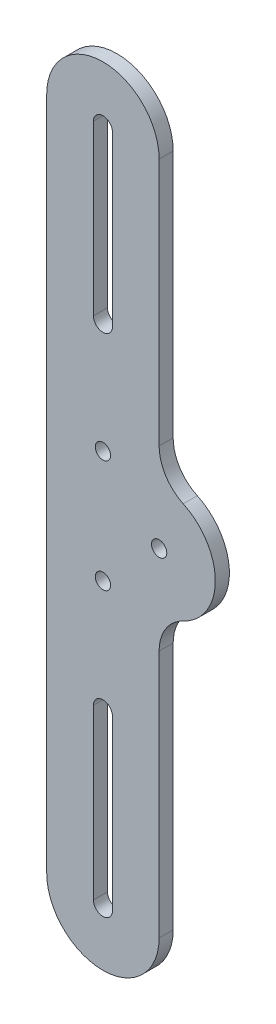
ISO-10303-21;
HEADER;
FILE_DESCRIPTION(('STEP AP214'),'2;1');
FILE_NAME('part.step','',(''),(''),'','','');
FILE_SCHEMA(('AUTOMOTIVE_DESIGN { 1 0 10303 214 1 1 1 1 }'));
ENDSEC;
DATA;
#1=APPLICATION_CONTEXT('core data for automotive mechanical design processes');
#2=APPLICATION_PROTOCOL_DEFINITION('international standard','automotive_design',2000,#1);
#3=PRODUCT_CONTEXT('',#1,'mechanical');
#4=PRODUCT('Part','Part','',(#3));
#5=PRODUCT_RELATED_PRODUCT_CATEGORY('part','',(#4));
#6=PRODUCT_DEFINITION_FORMATION('','',#4);
#7=PRODUCT_DEFINITION_CONTEXT('part definition',#1,'design');
#8=PRODUCT_DEFINITION('design','',#6,#7);
#9=PRODUCT_DEFINITION_SHAPE('','',#8);
#10=(LENGTH_UNIT() NAMED_UNIT(*) SI_UNIT(.MILLI.,.METRE.));
#11=(NAMED_UNIT(*) PLANE_ANGLE_UNIT() SI_UNIT($,.RADIAN.));
#12=(NAMED_UNIT(*) SI_UNIT($,.STERADIAN.) SOLID_ANGLE_UNIT());
#13=UNCERTAINTY_MEASURE_WITH_UNIT(LENGTH_MEASURE(1.E-05),#10,'distance_accuracy_value','');
#14=(GEOMETRIC_REPRESENTATION_CONTEXT(3) GLOBAL_UNCERTAINTY_ASSIGNED_CONTEXT((#13)) GLOBAL_UNIT_ASSIGNED_CONTEXT((#10,
#11,#12)) REPRESENTATION_CONTEXT('',''));
#15=CARTESIAN_POINT('',(0.,0.,0.));
#16=DIRECTION('',(0.,0.,1.));
#17=DIRECTION('',(1.,0.,0.));
#18=AXIS2_PLACEMENT_3D('',#15,#16,#17);
#19=CARTESIAN_POINT('',(-19.05,-88.9,1.5875));
#20=DIRECTION('',(1.,0.,0.));
#21=DIRECTION('',(0.,0.,-1.));
#22=AXIS2_PLACEMENT_3D('',#19,#20,#21);
#23=PLANE('',#22);
#24=DIRECTION('',(0.,0.,1.));
#25=VECTOR('',#24,1.);
#26=CARTESIAN_POINT('',(-19.05,76.2,-1.5875));
#27=LINE('',#26,#25);
#28=CARTESIAN_POINT('',(-19.05,76.2,-1.5875));
#29=VERTEX_POINT('',#28);
#30=CARTESIAN_POINT('',(-19.05,76.2,1.5875));
#31=VERTEX_POINT('',#30);
#32=EDGE_CURVE('E149',#29,#31,#27,.T.);
#33=ORIENTED_EDGE('',*,*,#32,.F.);
#34=DIRECTION('',(0.,-1.,0.));
#35=VECTOR('',#34,1.);
#36=CARTESIAN_POINT('',(-19.05,-88.9,-1.5875));
#37=LINE('',#36,#35);
#38=CARTESIAN_POINT('',(-19.05,-76.2,-1.5875));
#39=VERTEX_POINT('',#38);
#40=EDGE_CURVE('E159',#29,#39,#37,.T.);
#41=ORIENTED_EDGE('',*,*,#40,.T.);
#42=DIRECTION('',(0.,0.,1.));
#43=VECTOR('',#42,1.);
#44=CARTESIAN_POINT('',(-19.05,-76.2,-1.5875));
#45=LINE('',#44,#43);
#46=CARTESIAN_POINT('',(-19.05,-76.2,1.5875));
#47=VERTEX_POINT('',#46);
#48=EDGE_CURVE('E162',#39,#47,#45,.T.);
#49=ORIENTED_EDGE('',*,*,#48,.T.);
#50=DIRECTION('',(0.,-1.,0.));
#51=VECTOR('',#50,1.);
#52=CARTESIAN_POINT('',(-19.05,-88.9,1.5875));
#53=LINE('',#52,#51);
#54=EDGE_CURVE('E161',#31,#47,#53,.T.);
#55=ORIENTED_EDGE('',*,*,#54,.F.);
#56=EDGE_LOOP('',(#33,#41,#49,#55));
#57=FACE_BOUND('',#56,.T.);
#58=ADVANCED_FACE('F35',(#57),#23,.F.);
#59=CARTESIAN_POINT('',(0.,0.,1.5875));
#60=DIRECTION('',(0.,0.,1.));
#61=DIRECTION('',(1.,0.,0.));
#62=AXIS2_PLACEMENT_3D('',#59,#60,#61);
#63=PLANE('',#62);
#64=CARTESIAN_POINT('',(-6.35000000000001,-38.1,1.5875));
#65=DIRECTION('',(0.,0.,1.));
#66=DIRECTION('',(1.,0.,0.));
#67=AXIS2_PLACEMENT_3D('',#64,#65,#66);
#68=CIRCLE('',#67,2.14884);
#69=CARTESIAN_POINT('',(-4.20116000000001,-38.1,1.5875));
#70=VERTEX_POINT('',#69);
#71=CARTESIAN_POINT('',(-8.49884000000001,-38.1,1.5875));
#72=VERTEX_POINT('',#71);
#73=EDGE_CURVE('E49',#70,#72,#68,.T.);
#74=ORIENTED_EDGE('',*,*,#73,.F.);
#75=DIRECTION('',(0.,1.,0.));
#76=VECTOR('',#75,1.);
#77=CARTESIAN_POINT('',(-4.20116000000001,-38.1,1.5875));
#78=LINE('',#77,#76);
#79=CARTESIAN_POINT('',(-4.20116000000001,-76.2,1.5875));
#80=VERTEX_POINT('',#79);
#81=EDGE_CURVE('E232',#80,#70,#78,.T.);
#82=ORIENTED_EDGE('',*,*,#81,.F.);
#83=CARTESIAN_POINT('',(-6.35000000000001,-76.2,1.5875));
#84=DIRECTION('',(0.,0.,1.));
#85=DIRECTION('',(1.,0.,0.));
#86=AXIS2_PLACEMENT_3D('',#83,#84,#85);
#87=CIRCLE('',#86,2.14884);
#88=CARTESIAN_POINT('',(-8.49884000000001,-76.2,1.5875));
#89=VERTEX_POINT('',#88);
#90=EDGE_CURVE('E244',#89,#80,#87,.T.);
#91=ORIENTED_EDGE('',*,*,#90,.F.);
#92=DIRECTION('',(0.,-1.,0.));
#93=VECTOR('',#92,1.);
#94=CARTESIAN_POINT('',(-8.49884000000001,-38.1,1.5875));
#95=LINE('',#94,#93);
#96=EDGE_CURVE('E241',#72,#89,#95,.T.);
#97=ORIENTED_EDGE('',*,*,#96,.F.);
#98=EDGE_LOOP('',(#74,#82,#91,#97));
#99=FACE_BOUND('',#98,.T.);
#100=CARTESIAN_POINT('',(-6.35000000000001,76.2,1.5875));
#101=DIRECTION('',(0.,0.,1.));
#102=DIRECTION('',(1.,0.,0.));
#103=AXIS2_PLACEMENT_3D('',#100,#101,#102);
#104=CIRCLE('',#103,2.14884);
#105=CARTESIAN_POINT('',(-4.20116000000001,76.2,1.5875));
#106=VERTEX_POINT('',#105);
#107=CARTESIAN_POINT('',(-8.49884000000001,76.2,1.5875));
#108=VERTEX_POINT('',#107);
#109=EDGE_CURVE('E251',#106,#108,#104,.T.);
#110=ORIENTED_EDGE('',*,*,#109,.F.);
#111=DIRECTION('',(0.,1.,0.));
#112=VECTOR('',#111,1.);
#113=CARTESIAN_POINT('',(-4.20116000000001,76.2,1.5875));
#114=LINE('',#113,#112);
#115=CARTESIAN_POINT('',(-4.20116,38.1,1.5875));
#116=VERTEX_POINT('',#115);
#117=EDGE_CURVE('E261',#116,#106,#114,.T.);
#118=ORIENTED_EDGE('',*,*,#117,.F.);
#119=CARTESIAN_POINT('',(-6.35000000000001,38.1,1.5875));
#120=DIRECTION('',(0.,0.,1.));
#121=DIRECTION('',(1.,0.,0.));
#122=AXIS2_PLACEMENT_3D('',#119,#120,#121);
#123=CIRCLE('',#122,2.14884);
#124=CARTESIAN_POINT('',(-8.49884000000001,38.1,1.5875));
#125=VERTEX_POINT('',#124);
#126=EDGE_CURVE('E275',#125,#116,#123,.T.);
#127=ORIENTED_EDGE('',*,*,#126,.F.);
#128=DIRECTION('',(0.,-1.,0.));
#129=VECTOR('',#128,1.);
#130=CARTESIAN_POINT('',(-8.49884000000001,76.2,1.5875));
#131=LINE('',#130,#129);
#132=EDGE_CURVE('E272',#108,#125,#131,.T.);
#133=ORIENTED_EDGE('',*,*,#132,.F.);
#134=EDGE_LOOP('',(#110,#118,#127,#133));
#135=FACE_BOUND('',#134,.T.);
#136=CARTESIAN_POINT('',(-6.35000000000001,12.7,1.5875));
#137=DIRECTION('',(0.,0.,1.));
#138=DIRECTION('',(1.,0.,0.));
#139=AXIS2_PLACEMENT_3D('',#136,#137,#138);
#140=CIRCLE('',#139,1.72719999999999);
#141=CARTESIAN_POINT('',(-4.62280000000002,12.7,1.5875));
#142=VERTEX_POINT('',#141);
#143=EDGE_CURVE('E282',#142,#142,#140,.T.);
#144=ORIENTED_EDGE('',*,*,#143,.F.);
#145=EDGE_LOOP('',(#144));
#146=FACE_BOUND('',#145,.T.);
#147=CARTESIAN_POINT('',(-6.35000000000001,-12.7,1.5875));
#148=DIRECTION('',(0.,0.,1.));
#149=DIRECTION('',(1.,0.,0.));
#150=AXIS2_PLACEMENT_3D('',#147,#148,#149);
#151=CIRCLE('',#150,1.72719999999999);
#152=CARTESIAN_POINT('',(-4.62280000000002,-12.7,1.5875));
#153=VERTEX_POINT('',#152);
#154=EDGE_CURVE('E294',#153,#153,#151,.T.);
#155=ORIENTED_EDGE('',*,*,#154,.F.);
#156=EDGE_LOOP('',(#155));
#157=FACE_BOUND('',#156,.T.);
#158=CARTESIAN_POINT('',(6.34999999999999,0.,1.5875));
#159=DIRECTION('',(0.,0.,1.));
#160=DIRECTION('',(1.,0.,0.));
#161=AXIS2_PLACEMENT_3D('',#158,#159,#160);
#162=CIRCLE('',#161,1.72719999999999);
#163=CARTESIAN_POINT('',(8.07719999999998,0.,1.5875));
#164=VERTEX_POINT('',#163);
#165=EDGE_CURVE('E173',#164,#164,#162,.T.);
#166=ORIENTED_EDGE('',*,*,#165,.F.);
#167=EDGE_LOOP('',(#166));
#168=FACE_BOUND('',#167,.T.);
#169=CARTESIAN_POINT('',(-6.35000000000001,76.2,1.5875));
#170=DIRECTION('',(0.,0.,1.));
#171=DIRECTION('',(-1.,0.,0.));
#172=AXIS2_PLACEMENT_3D('',#169,#170,#171);
#173=CIRCLE('',#172,12.7);
#174=CARTESIAN_POINT('',(6.34999999999998,76.2,1.5875));
#175=VERTEX_POINT('',#174);
#176=EDGE_CURVE('E203',#175,#31,#173,.T.);
#177=ORIENTED_EDGE('',*,*,#176,.T.);
#178=ORIENTED_EDGE('',*,*,#54,.T.);
#179=CARTESIAN_POINT('',(-6.34999999999999,-76.2,1.5875));
#180=DIRECTION('',(0.,0.,1.));
#181=DIRECTION('',(1.,0.,0.));
#182=AXIS2_PLACEMENT_3D('',#179,#180,#181);
#183=CIRCLE('',#182,12.7);
#184=CARTESIAN_POINT('',(6.35000000000001,-76.2,1.5875));
#185=VERTEX_POINT('',#184);
#186=EDGE_CURVE('E205',#47,#185,#183,.T.);
#187=ORIENTED_EDGE('',*,*,#186,.T.);
#188=DIRECTION('',(0.,1.,0.));
#189=VECTOR('',#188,1.);
#190=CARTESIAN_POINT('',(6.35,-76.2,1.5875));
#191=LINE('',#190,#189);
#192=CARTESIAN_POINT('',(6.34999999999999,-20.0804631420692,1.5875));
#193=VERTEX_POINT('',#192);
#194=EDGE_CURVE('E207',#185,#193,#191,.T.);
#195=ORIENTED_EDGE('',*,*,#194,.T.);
#196=CARTESIAN_POINT('',(15.875,-20.0804631420692,1.5875));
#197=DIRECTION('',(0.,0.,-1.));
#198=DIRECTION('',(1.,0.,0.));
#199=AXIS2_PLACEMENT_3D('',#196,#197,#198);
#200=CIRCLE('',#199,9.525);
#201=CARTESIAN_POINT('',(11.7928571428571,-11.4745503668967,1.5875));
#202=VERTEX_POINT('',#201);
#203=EDGE_CURVE('E210',#193,#202,#200,.T.);
#204=ORIENTED_EDGE('',*,*,#203,.T.);
#205=CARTESIAN_POINT('',(6.34999999999999,0.,1.5875));
#206=DIRECTION('',(0.,0.,1.));
#207=DIRECTION('',(1.,0.,0.));
#208=AXIS2_PLACEMENT_3D('',#205,#206,#207);
#209=CIRCLE('',#208,12.7);
#210=CARTESIAN_POINT('',(11.7928571428571,11.4745503668967,1.5875));
#211=VERTEX_POINT('',#210);
#212=EDGE_CURVE('E213',#202,#211,#209,.T.);
#213=ORIENTED_EDGE('',*,*,#212,.T.);
#214=CARTESIAN_POINT('',(15.875,20.0804631420692,1.5875));
#215=DIRECTION('',(0.,0.,-1.));
#216=DIRECTION('',(-1.,0.,0.));
#217=AXIS2_PLACEMENT_3D('',#214,#215,#216);
#218=CIRCLE('',#217,9.525);
#219=CARTESIAN_POINT('',(6.34999999999999,20.0804631420692,1.5875));
#220=VERTEX_POINT('',#219);
#221=EDGE_CURVE('E193',#211,#220,#218,.T.);
#222=ORIENTED_EDGE('',*,*,#221,.T.);
#223=DIRECTION('',(0.,1.,0.));
#224=VECTOR('',#223,1.);
#225=CARTESIAN_POINT('',(6.34999999999998,76.2,1.5875));
#226=LINE('',#225,#224);
#227=EDGE_CURVE('E216',#220,#175,#226,.T.);
#228=ORIENTED_EDGE('',*,*,#227,.T.);
#229=EDGE_LOOP('',(#177,#178,#187,#195,#204,#213,#222,#228));
#230=FACE_BOUND('',#229,.T.);
#231=ADVANCED_FACE('F305',(#99,#135,#146,#157,#168,#230),#63,.T.);
#232=CARTESIAN_POINT('',(0.,0.,-1.5875));
#233=DIRECTION('',(0.,0.,1.));
#234=DIRECTION('',(1.,0.,0.));
#235=AXIS2_PLACEMENT_3D('',#232,#233,#234);
#236=PLANE('',#235);
#237=DIRECTION('',(0.,1.,0.));
#238=VECTOR('',#237,1.);
#239=CARTESIAN_POINT('',(-4.20116000000001,-38.1,-1.5875));
#240=LINE('',#239,#238);
#241=CARTESIAN_POINT('',(-4.20116000000001,-76.2,-1.5875));
#242=VERTEX_POINT('',#241);
#243=CARTESIAN_POINT('',(-4.20116000000001,-38.1,-1.5875));
#244=VERTEX_POINT('',#243);
#245=EDGE_CURVE('E236',#242,#244,#240,.T.);
#246=ORIENTED_EDGE('',*,*,#245,.T.);
#247=CARTESIAN_POINT('',(-6.35000000000001,-38.1,-1.5875));
#248=DIRECTION('',(0.,0.,1.));
#249=DIRECTION('',(1.,0.,0.));
#250=AXIS2_PLACEMENT_3D('',#247,#248,#249);
#251=CIRCLE('',#250,2.14884);
#252=CARTESIAN_POINT('',(-8.49884000000001,-38.1,-1.5875));
#253=VERTEX_POINT('',#252);
#254=EDGE_CURVE('E228',#244,#253,#251,.T.);
#255=ORIENTED_EDGE('',*,*,#254,.T.);
#256=DIRECTION('',(0.,-1.,0.));
#257=VECTOR('',#256,1.);
#258=CARTESIAN_POINT('',(-8.49884000000001,-38.1,-1.5875));
#259=LINE('',#258,#257);
#260=CARTESIAN_POINT('',(-8.49884,-76.2,-1.5875));
#261=VERTEX_POINT('',#260);
#262=EDGE_CURVE('E231',#253,#261,#259,.T.);
#263=ORIENTED_EDGE('',*,*,#262,.T.);
#264=CARTESIAN_POINT('',(-6.35000000000001,-76.2,-1.5875));
#265=DIRECTION('',(0.,0.,1.));
#266=DIRECTION('',(1.,0.,0.));
#267=AXIS2_PLACEMENT_3D('',#264,#265,#266);
#268=CIRCLE('',#267,2.14884);
#269=EDGE_CURVE('E57',#261,#242,#268,.T.);
#270=ORIENTED_EDGE('',*,*,#269,.T.);
#271=EDGE_LOOP('',(#246,#255,#263,#270));
#272=FACE_BOUND('',#271,.T.);
#273=DIRECTION('',(0.,1.,0.));
#274=VECTOR('',#273,1.);
#275=CARTESIAN_POINT('',(-4.20116000000001,76.2,-1.5875));
#276=LINE('',#275,#274);
#277=CARTESIAN_POINT('',(-4.20116,38.1,-1.5875));
#278=VERTEX_POINT('',#277);
#279=CARTESIAN_POINT('',(-4.20116000000001,76.2,-1.5875));
#280=VERTEX_POINT('',#279);
#281=EDGE_CURVE('E267',#278,#280,#276,.T.);
#282=ORIENTED_EDGE('',*,*,#281,.T.);
#283=CARTESIAN_POINT('',(-6.35000000000001,76.2,-1.5875));
#284=DIRECTION('',(0.,0.,1.));
#285=DIRECTION('',(1.,0.,0.));
#286=AXIS2_PLACEMENT_3D('',#283,#284,#285);
#287=CIRCLE('',#286,2.14884);
#288=CARTESIAN_POINT('',(-8.49884000000001,76.2,-1.5875));
#289=VERTEX_POINT('',#288);
#290=EDGE_CURVE('E257',#280,#289,#287,.T.);
#291=ORIENTED_EDGE('',*,*,#290,.T.);
#292=DIRECTION('',(0.,-1.,0.));
#293=VECTOR('',#292,1.);
#294=CARTESIAN_POINT('',(-8.49884000000001,76.2,-1.5875));
#295=LINE('',#294,#293);
#296=CARTESIAN_POINT('',(-8.49884000000001,38.1,-1.5875));
#297=VERTEX_POINT('',#296);
#298=EDGE_CURVE('E260',#289,#297,#295,.T.);
#299=ORIENTED_EDGE('',*,*,#298,.T.);
#300=CARTESIAN_POINT('',(-6.35000000000001,38.1,-1.5875));
#301=DIRECTION('',(0.,0.,1.));
#302=DIRECTION('',(1.,0.,0.));
#303=AXIS2_PLACEMENT_3D('',#300,#301,#302);
#304=CIRCLE('',#303,2.14884);
#305=EDGE_CURVE('E264',#297,#278,#304,.T.);
#306=ORIENTED_EDGE('',*,*,#305,.T.);
#307=EDGE_LOOP('',(#282,#291,#299,#306));
#308=FACE_BOUND('',#307,.T.);
#309=CARTESIAN_POINT('',(-6.35000000000001,12.7,-1.5875));
#310=DIRECTION('',(0.,0.,1.));
#311=DIRECTION('',(1.,0.,0.));
#312=AXIS2_PLACEMENT_3D('',#309,#310,#311);
#313=CIRCLE('',#312,1.7272);
#314=CARTESIAN_POINT('',(-4.62280000000001,12.7,-1.5875));
#315=VERTEX_POINT('',#314);
#316=EDGE_CURVE('E291',#315,#315,#313,.T.);
#317=ORIENTED_EDGE('',*,*,#316,.T.);
#318=EDGE_LOOP('',(#317));
#319=FACE_BOUND('',#318,.T.);
#320=CARTESIAN_POINT('',(-6.35000000000001,-12.7,-1.5875));
#321=DIRECTION('',(0.,0.,1.));
#322=DIRECTION('',(1.,0.,0.));
#323=AXIS2_PLACEMENT_3D('',#320,#321,#322);
#324=CIRCLE('',#323,1.7272);
#325=CARTESIAN_POINT('',(-4.62280000000001,-12.7,-1.5875));
#326=VERTEX_POINT('',#325);
#327=EDGE_CURVE('E297',#326,#326,#324,.T.);
#328=ORIENTED_EDGE('',*,*,#327,.T.);
#329=EDGE_LOOP('',(#328));
#330=FACE_BOUND('',#329,.T.);
#331=CARTESIAN_POINT('',(6.34999999999999,0.,-1.5875));
#332=DIRECTION('',(0.,0.,1.));
#333=DIRECTION('',(1.,0.,0.));
#334=AXIS2_PLACEMENT_3D('',#331,#332,#333);
#335=CIRCLE('',#334,1.7272);
#336=CARTESIAN_POINT('',(8.07719999999999,0.,-1.5875));
#337=VERTEX_POINT('',#336);
#338=EDGE_CURVE('E169',#337,#337,#335,.T.);
#339=ORIENTED_EDGE('',*,*,#338,.T.);
#340=EDGE_LOOP('',(#339));
#341=FACE_BOUND('',#340,.T.);
#342=CARTESIAN_POINT('',(-6.35000000000001,76.2,-1.5875));
#343=DIRECTION('',(0.,0.,1.));
#344=DIRECTION('',(1.,0.,0.));
#345=AXIS2_PLACEMENT_3D('',#342,#343,#344);
#346=CIRCLE('',#345,12.7);
#347=CARTESIAN_POINT('',(6.34999999999998,76.2,-1.5875));
#348=VERTEX_POINT('',#347);
#349=EDGE_CURVE('E12',#348,#29,#346,.T.);
#350=ORIENTED_EDGE('',*,*,#349,.F.);
#351=DIRECTION('',(0.,1.,0.));
#352=VECTOR('',#351,1.);
#353=CARTESIAN_POINT('',(6.34999999999998,76.2,-1.5875));
#354=LINE('',#353,#352);
#355=CARTESIAN_POINT('',(6.34999999999999,20.0804631420692,-1.5875));
#356=VERTEX_POINT('',#355);
#357=EDGE_CURVE('E163',#356,#348,#354,.T.);
#358=ORIENTED_EDGE('',*,*,#357,.F.);
#359=CARTESIAN_POINT('',(15.875,20.0804631420692,-1.5875));
#360=DIRECTION('',(0.,0.,-1.));
#361=DIRECTION('',(-1.,0.,0.));
#362=AXIS2_PLACEMENT_3D('',#359,#360,#361);
#363=CIRCLE('',#362,9.525);
#364=CARTESIAN_POINT('',(11.7928571428571,11.4745503668967,-1.5875));
#365=VERTEX_POINT('',#364);
#366=EDGE_CURVE('E191',#365,#356,#363,.T.);
#367=ORIENTED_EDGE('',*,*,#366,.F.);
#368=CARTESIAN_POINT('',(6.34999999999999,0.,-1.5875));
#369=DIRECTION('',(0.,0.,1.));
#370=DIRECTION('',(1.,0.,0.));
#371=AXIS2_PLACEMENT_3D('',#368,#369,#370);
#372=CIRCLE('',#371,12.7);
#373=CARTESIAN_POINT('',(11.7928571428571,-11.4745503668967,-1.5875));
#374=VERTEX_POINT('',#373);
#375=EDGE_CURVE('E42',#374,#365,#372,.T.);
#376=ORIENTED_EDGE('',*,*,#375,.F.);
#377=CARTESIAN_POINT('',(15.875,-20.0804631420692,-1.5875));
#378=DIRECTION('',(0.,0.,-1.));
#379=DIRECTION('',(1.,0.,0.));
#380=AXIS2_PLACEMENT_3D('',#377,#378,#379);
#381=CIRCLE('',#380,9.525);
#382=CARTESIAN_POINT('',(6.34999999999999,-20.0804631420692,-1.5875));
#383=VERTEX_POINT('',#382);
#384=EDGE_CURVE('E196',#383,#374,#381,.T.);
#385=ORIENTED_EDGE('',*,*,#384,.F.);
#386=DIRECTION('',(0.,1.,0.));
#387=VECTOR('',#386,1.);
#388=CARTESIAN_POINT('',(6.35,-76.2,-1.5875));
#389=LINE('',#388,#387);
#390=CARTESIAN_POINT('',(6.35000000000001,-76.2,-1.5875));
#391=VERTEX_POINT('',#390);
#392=EDGE_CURVE('E199',#391,#383,#389,.T.);
#393=ORIENTED_EDGE('',*,*,#392,.F.);
#394=CARTESIAN_POINT('',(-6.34999999999999,-76.2,-1.5875));
#395=DIRECTION('',(0.,0.,1.));
#396=DIRECTION('',(1.,0.,0.));
#397=AXIS2_PLACEMENT_3D('',#394,#395,#396);
#398=CIRCLE('',#397,12.7);
#399=EDGE_CURVE('E167',#39,#391,#398,.T.);
#400=ORIENTED_EDGE('',*,*,#399,.F.);
#401=ORIENTED_EDGE('',*,*,#40,.F.);
#402=EDGE_LOOP('',(#350,#358,#367,#376,#385,#393,#400,#401));
#403=FACE_BOUND('',#402,.T.);
#404=ADVANCED_FACE('F165',(#272,#308,#319,#330,#341,#403),#236,.F.);
#405=CARTESIAN_POINT('',(6.34999999999999,0.,1.5875));
#406=DIRECTION('',(0.,0.,1.));
#407=DIRECTION('',(1.,0.,0.));
#408=AXIS2_PLACEMENT_3D('',#405,#406,#407);
#409=CYLINDRICAL_SURFACE('',#408,1.72719999999999);
#410=ORIENTED_EDGE('',*,*,#338,.F.);
#411=EDGE_LOOP('',(#410));
#412=FACE_BOUND('',#411,.T.);
#413=ORIENTED_EDGE('',*,*,#165,.T.);
#414=EDGE_LOOP('',(#413));
#415=FACE_BOUND('',#414,.T.);
#416=ADVANCED_FACE('F303',(#412,#415),#409,.F.);
#417=CARTESIAN_POINT('',(-6.35000000000001,-12.7,1.5875));
#418=DIRECTION('',(0.,0.,1.));
#419=DIRECTION('',(1.,0.,0.));
#420=AXIS2_PLACEMENT_3D('',#417,#418,#419);
#421=CYLINDRICAL_SURFACE('',#420,1.72719999999999);
#422=ORIENTED_EDGE('',*,*,#327,.F.);
#423=EDGE_LOOP('',(#422));
#424=FACE_BOUND('',#423,.T.);
#425=ORIENTED_EDGE('',*,*,#154,.T.);
#426=EDGE_LOOP('',(#425));
#427=FACE_BOUND('',#426,.T.);
#428=ADVANCED_FACE('F345',(#424,#427),#421,.F.);
#429=CARTESIAN_POINT('',(-6.35000000000001,12.7,1.5875));
#430=DIRECTION('',(0.,0.,1.));
#431=DIRECTION('',(1.,0.,0.));
#432=AXIS2_PLACEMENT_3D('',#429,#430,#431);
#433=CYLINDRICAL_SURFACE('',#432,1.72719999999999);
#434=ORIENTED_EDGE('',*,*,#316,.F.);
#435=EDGE_LOOP('',(#434));
#436=FACE_BOUND('',#435,.T.);
#437=ORIENTED_EDGE('',*,*,#143,.T.);
#438=EDGE_LOOP('',(#437));
#439=FACE_BOUND('',#438,.T.);
#440=ADVANCED_FACE('F353',(#436,#439),#433,.F.);
#441=CARTESIAN_POINT('',(-6.35000000000001,76.2,-1.5875));
#442=DIRECTION('',(0.,0.,1.));
#443=DIRECTION('',(1.,0.,0.));
#444=AXIS2_PLACEMENT_3D('',#441,#442,#443);
#445=CYLINDRICAL_SURFACE('',#444,2.14884);
#446=ORIENTED_EDGE('',*,*,#109,.T.);
#447=DIRECTION('',(0.,0.,1.));
#448=VECTOR('',#447,1.);
#449=CARTESIAN_POINT('',(-8.49884000000001,76.2,-1.5875));
#450=LINE('',#449,#448);
#451=EDGE_CURVE('E270',#289,#108,#450,.T.);
#452=ORIENTED_EDGE('',*,*,#451,.F.);
#453=ORIENTED_EDGE('',*,*,#290,.F.);
#454=DIRECTION('',(0.,0.,1.));
#455=VECTOR('',#454,1.);
#456=CARTESIAN_POINT('',(-4.20116000000001,76.2,-1.5875));
#457=LINE('',#456,#455);
#458=EDGE_CURVE('E280',#280,#106,#457,.T.);
#459=ORIENTED_EDGE('',*,*,#458,.T.);
#460=EDGE_LOOP('',(#446,#452,#453,#459));
#461=FACE_BOUND('',#460,.T.);
#462=ADVANCED_FACE('F361',(#461),#445,.F.);
#463=CARTESIAN_POINT('',(-4.20116000000001,76.2,-1.5875));
#464=DIRECTION('',(1.,0.,0.));
#465=DIRECTION('',(0.,1.,0.));
#466=AXIS2_PLACEMENT_3D('',#463,#464,#465);
#467=PLANE('',#466);
#468=ORIENTED_EDGE('',*,*,#117,.T.);
#469=ORIENTED_EDGE('',*,*,#458,.F.);
#470=ORIENTED_EDGE('',*,*,#281,.F.);
#471=DIRECTION('',(0.,0.,1.));
#472=VECTOR('',#471,1.);
#473=CARTESIAN_POINT('',(-4.20116,38.1,-1.5875));
#474=LINE('',#473,#472);
#475=EDGE_CURVE('E283',#278,#116,#474,.T.);
#476=ORIENTED_EDGE('',*,*,#475,.T.);
#477=EDGE_LOOP('',(#468,#469,#470,#476));
#478=FACE_BOUND('',#477,.T.);
#479=ADVANCED_FACE('F369',(#478),#467,.F.);
#480=CARTESIAN_POINT('',(-6.35000000000001,38.1,-1.5875));
#481=DIRECTION('',(0.,0.,1.));
#482=DIRECTION('',(1.,0.,0.));
#483=AXIS2_PLACEMENT_3D('',#480,#481,#482);
#484=CYLINDRICAL_SURFACE('',#483,2.14884);
#485=ORIENTED_EDGE('',*,*,#126,.T.);
#486=ORIENTED_EDGE('',*,*,#475,.F.);
#487=ORIENTED_EDGE('',*,*,#305,.F.);
#488=DIRECTION('',(0.,0.,1.));
#489=VECTOR('',#488,1.);
#490=CARTESIAN_POINT('',(-8.49884000000001,38.1,-1.5875));
#491=LINE('',#490,#489);
#492=EDGE_CURVE('E285',#297,#125,#491,.T.);
#493=ORIENTED_EDGE('',*,*,#492,.T.);
#494=EDGE_LOOP('',(#485,#486,#487,#493));
#495=FACE_BOUND('',#494,.T.);
#496=ADVANCED_FACE('F377',(#495),#484,.F.);
#497=CARTESIAN_POINT('',(-8.49884000000001,76.2,-1.5875));
#498=DIRECTION('',(-1.,0.,0.));
#499=DIRECTION('',(0.,-1.,0.));
#500=AXIS2_PLACEMENT_3D('',#497,#498,#499);
#501=PLANE('',#500);
#502=ORIENTED_EDGE('',*,*,#132,.T.);
#503=ORIENTED_EDGE('',*,*,#492,.F.);
#504=ORIENTED_EDGE('',*,*,#298,.F.);
#505=ORIENTED_EDGE('',*,*,#451,.T.);
#506=EDGE_LOOP('',(#502,#503,#504,#505));
#507=FACE_BOUND('',#506,.T.);
#508=ADVANCED_FACE('F385',(#507),#501,.F.);
#509=CARTESIAN_POINT('',(-6.35000000000001,-38.1,-1.5875));
#510=DIRECTION('',(0.,0.,1.));
#511=DIRECTION('',(1.,0.,0.));
#512=AXIS2_PLACEMENT_3D('',#509,#510,#511);
#513=CYLINDRICAL_SURFACE('',#512,2.14884);
#514=ORIENTED_EDGE('',*,*,#73,.T.);
#515=DIRECTION('',(0.,0.,1.));
#516=VECTOR('',#515,1.);
#517=CARTESIAN_POINT('',(-8.49884000000001,-38.1,-1.5875));
#518=LINE('',#517,#516);
#519=EDGE_CURVE('E239',#253,#72,#518,.T.);
#520=ORIENTED_EDGE('',*,*,#519,.F.);
#521=ORIENTED_EDGE('',*,*,#254,.F.);
#522=DIRECTION('',(0.,0.,1.));
#523=VECTOR('',#522,1.);
#524=CARTESIAN_POINT('',(-4.20116000000001,-38.1,-1.5875));
#525=LINE('',#524,#523);
#526=EDGE_CURVE('E249',#244,#70,#525,.T.);
#527=ORIENTED_EDGE('',*,*,#526,.T.);
#528=EDGE_LOOP('',(#514,#520,#521,#527));
#529=FACE_BOUND('',#528,.T.);
#530=ADVANCED_FACE('F393',(#529),#513,.F.);
#531=CARTESIAN_POINT('',(-4.20116000000001,-38.1,-1.5875));
#532=DIRECTION('',(1.,0.,0.));
#533=DIRECTION('',(0.,1.,0.));
#534=AXIS2_PLACEMENT_3D('',#531,#532,#533);
#535=PLANE('',#534);
#536=ORIENTED_EDGE('',*,*,#81,.T.);
#537=ORIENTED_EDGE('',*,*,#526,.F.);
#538=ORIENTED_EDGE('',*,*,#245,.F.);
#539=DIRECTION('',(0.,0.,1.));
#540=VECTOR('',#539,1.);
#541=CARTESIAN_POINT('',(-4.20116000000001,-76.2,-1.5875));
#542=LINE('',#541,#540);
#543=EDGE_CURVE('E252',#242,#80,#542,.T.);
#544=ORIENTED_EDGE('',*,*,#543,.T.);
#545=EDGE_LOOP('',(#536,#537,#538,#544));
#546=FACE_BOUND('',#545,.T.);
#547=ADVANCED_FACE('F401',(#546),#535,.F.);
#548=CARTESIAN_POINT('',(-6.35000000000001,-76.2,-1.5875));
#549=DIRECTION('',(0.,0.,1.));
#550=DIRECTION('',(1.,0.,0.));
#551=AXIS2_PLACEMENT_3D('',#548,#549,#550);
#552=CYLINDRICAL_SURFACE('',#551,2.14884);
#553=ORIENTED_EDGE('',*,*,#90,.T.);
#554=ORIENTED_EDGE('',*,*,#543,.F.);
#555=ORIENTED_EDGE('',*,*,#269,.F.);
#556=DIRECTION('',(0.,0.,1.));
#557=VECTOR('',#556,1.);
#558=CARTESIAN_POINT('',(-8.49884000000001,-76.2,-1.5875));
#559=LINE('',#558,#557);
#560=EDGE_CURVE('E254',#261,#89,#559,.T.);
#561=ORIENTED_EDGE('',*,*,#560,.T.);
#562=EDGE_LOOP('',(#553,#554,#555,#561));
#563=FACE_BOUND('',#562,.T.);
#564=ADVANCED_FACE('F408',(#563),#552,.F.);
#565=CARTESIAN_POINT('',(-8.49884000000001,-38.1,-1.5875));
#566=DIRECTION('',(-1.,0.,0.));
#567=DIRECTION('',(0.,-1.,0.));
#568=AXIS2_PLACEMENT_3D('',#565,#566,#567);
#569=PLANE('',#568);
#570=ORIENTED_EDGE('',*,*,#96,.T.);
#571=ORIENTED_EDGE('',*,*,#560,.F.);
#572=ORIENTED_EDGE('',*,*,#262,.F.);
#573=ORIENTED_EDGE('',*,*,#519,.T.);
#574=EDGE_LOOP('',(#570,#571,#572,#573));
#575=FACE_BOUND('',#574,.T.);
#576=ADVANCED_FACE('F416',(#575),#569,.F.);
#577=CARTESIAN_POINT('',(-6.35000000000001,76.2,-1.5875));
#578=DIRECTION('',(0.,0.,1.));
#579=DIRECTION('',(1.,0.,0.));
#580=AXIS2_PLACEMENT_3D('',#577,#578,#579);
#581=CYLINDRICAL_SURFACE('',#580,12.7);
#582=DIRECTION('',(0.,0.,1.));
#583=VECTOR('',#582,1.);
#584=CARTESIAN_POINT('',(6.34999999999998,76.2,-1.5875));
#585=LINE('',#584,#583);
#586=EDGE_CURVE('E151',#348,#175,#585,.T.);
#587=ORIENTED_EDGE('',*,*,#586,.F.);
#588=ORIENTED_EDGE('',*,*,#349,.T.);
#589=ORIENTED_EDGE('',*,*,#32,.T.);
#590=ORIENTED_EDGE('',*,*,#176,.F.);
#591=EDGE_LOOP('',(#587,#588,#589,#590));
#592=FACE_BOUND('',#591,.T.);
#593=ADVANCED_FACE('F147',(#592),#581,.T.);
#594=CARTESIAN_POINT('',(6.34999999999999,0.,-1.5875));
#595=DIRECTION('',(0.,0.,1.));
#596=DIRECTION('',(1.,0.,0.));
#597=AXIS2_PLACEMENT_3D('',#594,#595,#596);
#598=CYLINDRICAL_SURFACE('',#597,12.7);
#599=DIRECTION('',(0.,0.,1.));
#600=VECTOR('',#599,1.);
#601=CARTESIAN_POINT('',(11.7928571428571,-11.4745503668967,-1.5875));
#602=LINE('',#601,#600);
#603=EDGE_CURVE('E184',#374,#202,#602,.T.);
#604=ORIENTED_EDGE('',*,*,#603,.F.);
#605=ORIENTED_EDGE('',*,*,#375,.T.);
#606=DIRECTION('',(0.,0.,1.));
#607=VECTOR('',#606,1.);
#608=CARTESIAN_POINT('',(11.7928571428571,11.4745503668967,-1.5875));
#609=LINE('',#608,#607);
#610=EDGE_CURVE('E182',#365,#211,#609,.T.);
#611=ORIENTED_EDGE('',*,*,#610,.T.);
#612=ORIENTED_EDGE('',*,*,#212,.F.);
#613=EDGE_LOOP('',(#604,#605,#611,#612));
#614=FACE_BOUND('',#613,.T.);
#615=ADVANCED_FACE('F180',(#614),#598,.T.);
#616=CARTESIAN_POINT('',(-6.34999999999999,-76.2,-1.5875));
#617=DIRECTION('',(0.,0.,1.));
#618=DIRECTION('',(1.,0.,0.));
#619=AXIS2_PLACEMENT_3D('',#616,#617,#618);
#620=CYLINDRICAL_SURFACE('',#619,12.7);
#621=ORIENTED_EDGE('',*,*,#48,.F.);
#622=ORIENTED_EDGE('',*,*,#399,.T.);
#623=DIRECTION('',(0.,0.,1.));
#624=VECTOR('',#623,1.);
#625=CARTESIAN_POINT('',(6.35000000000001,-76.2,-1.5875));
#626=LINE('',#625,#624);
#627=EDGE_CURVE('E224',#391,#185,#626,.T.);
#628=ORIENTED_EDGE('',*,*,#627,.T.);
#629=ORIENTED_EDGE('',*,*,#186,.F.);
#630=EDGE_LOOP('',(#621,#622,#628,#629));
#631=FACE_BOUND('',#630,.T.);
#632=ADVANCED_FACE('F314',(#631),#620,.T.);
#633=CARTESIAN_POINT('',(6.34999999999998,76.2,-1.5875));
#634=DIRECTION('',(1.,0.,0.));
#635=DIRECTION('',(0.,1.,0.));
#636=AXIS2_PLACEMENT_3D('',#633,#634,#635);
#637=PLANE('',#636);
#638=ORIENTED_EDGE('',*,*,#227,.F.);
#639=DIRECTION('',(0.,0.,1.));
#640=VECTOR('',#639,1.);
#641=CARTESIAN_POINT('',(6.34999999999999,20.0804631420692,-1.5875));
#642=LINE('',#641,#640);
#643=EDGE_CURVE('E194',#356,#220,#642,.T.);
#644=ORIENTED_EDGE('',*,*,#643,.F.);
#645=ORIENTED_EDGE('',*,*,#357,.T.);
#646=ORIENTED_EDGE('',*,*,#586,.T.);
#647=EDGE_LOOP('',(#638,#644,#645,#646));
#648=FACE_BOUND('',#647,.T.);
#649=ADVANCED_FACE('F312',(#648),#637,.T.);
#650=CARTESIAN_POINT('',(15.875,20.0804631420692,-1.5875));
#651=DIRECTION('',(0.,0.,1.));
#652=DIRECTION('',(1.,0.,0.));
#653=AXIS2_PLACEMENT_3D('',#650,#651,#652);
#654=CYLINDRICAL_SURFACE('',#653,9.525);
#655=ORIENTED_EDGE('',*,*,#221,.F.);
#656=ORIENTED_EDGE('',*,*,#610,.F.);
#657=ORIENTED_EDGE('',*,*,#366,.T.);
#658=ORIENTED_EDGE('',*,*,#643,.T.);
#659=EDGE_LOOP('',(#655,#656,#657,#658));
#660=FACE_BOUND('',#659,.T.);
#661=ADVANCED_FACE('F190',(#660),#654,.F.);
#662=CARTESIAN_POINT('',(15.875,-20.0804631420692,-1.5875));
#663=DIRECTION('',(0.,0.,1.));
#664=DIRECTION('',(1.,0.,0.));
#665=AXIS2_PLACEMENT_3D('',#662,#663,#664);
#666=CYLINDRICAL_SURFACE('',#665,9.525);
#667=ORIENTED_EDGE('',*,*,#203,.F.);
#668=DIRECTION('',(0.,0.,1.));
#669=VECTOR('',#668,1.);
#670=CARTESIAN_POINT('',(6.34999999999999,-20.0804631420692,-1.5875));
#671=LINE('',#670,#669);
#672=EDGE_CURVE('E222',#383,#193,#671,.T.);
#673=ORIENTED_EDGE('',*,*,#672,.F.);
#674=ORIENTED_EDGE('',*,*,#384,.T.);
#675=ORIENTED_EDGE('',*,*,#603,.T.);
#676=EDGE_LOOP('',(#667,#673,#674,#675));
#677=FACE_BOUND('',#676,.T.);
#678=ADVANCED_FACE('F320',(#677),#666,.F.);
#679=CARTESIAN_POINT('',(6.35,-76.2,-1.5875));
#680=DIRECTION('',(1.,0.,0.));
#681=DIRECTION('',(0.,1.,0.));
#682=AXIS2_PLACEMENT_3D('',#679,#680,#681);
#683=PLANE('',#682);
#684=ORIENTED_EDGE('',*,*,#194,.F.);
#685=ORIENTED_EDGE('',*,*,#627,.F.);
#686=ORIENTED_EDGE('',*,*,#392,.T.);
#687=ORIENTED_EDGE('',*,*,#672,.T.);
#688=EDGE_LOOP('',(#684,#685,#686,#687));
#689=FACE_BOUND('',#688,.T.);
#690=ADVANCED_FACE('F457',(#689),#683,.T.);
#691=CLOSED_SHELL('',(#58,#231,#404,#416,#428,#440,#462,#479,#496,#508,#530,#547,#564,#576,#593,
#615,#632,#649,#661,#678,#690));
#692=MANIFOLD_SOLID_BREP('B2',#691);
#693=ADVANCED_BREP_SHAPE_REPRESENTATION('',(#18,#692),#14);
#694=SHAPE_DEFINITION_REPRESENTATION(#9,#693);
ENDSEC;
END-ISO-10303-21;
